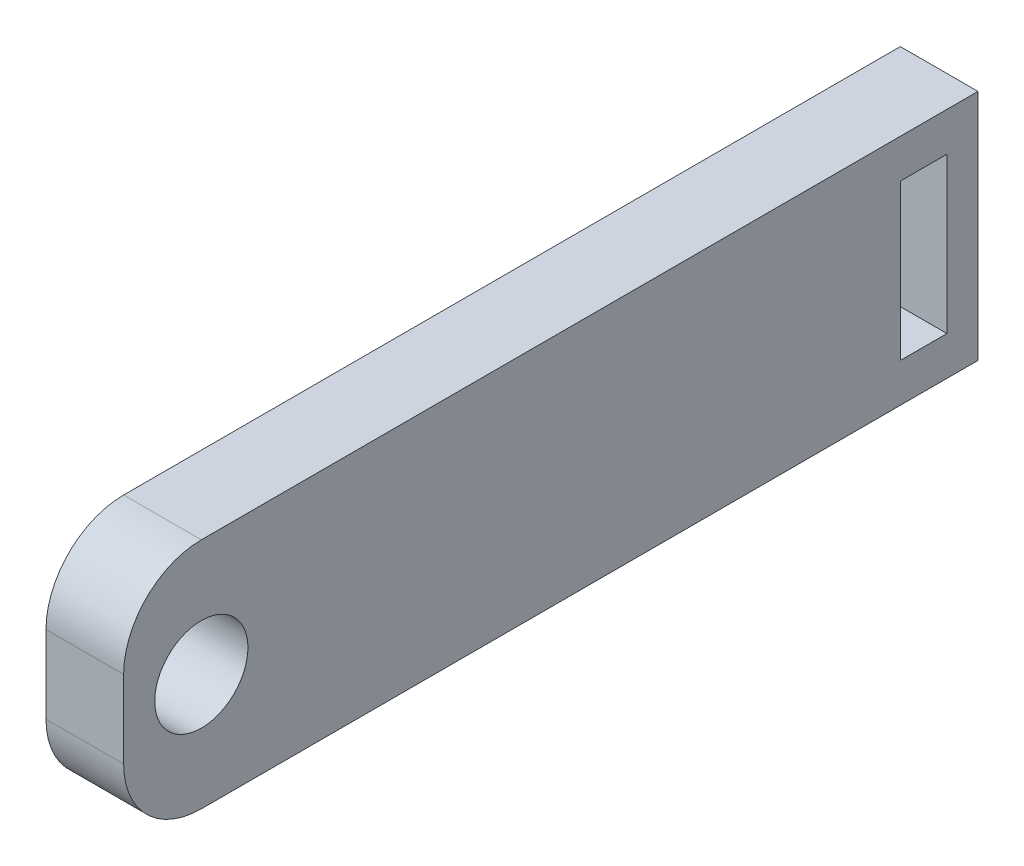
ISO-10303-21;
HEADER;
FILE_DESCRIPTION(('STEP AP214'),'2;1');
FILE_NAME('part.step','',(''),(''),'','','');
FILE_SCHEMA(('AUTOMOTIVE_DESIGN { 1 0 10303 214 1 1 1 1 }'));
ENDSEC;
DATA;
#1=APPLICATION_CONTEXT('core data for automotive mechanical design processes');
#2=APPLICATION_PROTOCOL_DEFINITION('international standard','automotive_design',2000,#1);
#3=PRODUCT_CONTEXT('',#1,'mechanical');
#4=PRODUCT('Part','Part','',(#3));
#5=PRODUCT_RELATED_PRODUCT_CATEGORY('part','',(#4));
#6=PRODUCT_DEFINITION_FORMATION('','',#4);
#7=PRODUCT_DEFINITION_CONTEXT('part definition',#1,'design');
#8=PRODUCT_DEFINITION('design','',#6,#7);
#9=PRODUCT_DEFINITION_SHAPE('','',#8);
#10=(LENGTH_UNIT() NAMED_UNIT(*) SI_UNIT(.MILLI.,.METRE.));
#11=(NAMED_UNIT(*) PLANE_ANGLE_UNIT() SI_UNIT($,.RADIAN.));
#12=(NAMED_UNIT(*) SI_UNIT($,.STERADIAN.) SOLID_ANGLE_UNIT());
#13=UNCERTAINTY_MEASURE_WITH_UNIT(LENGTH_MEASURE(1.E-05),#10,'distance_accuracy_value','');
#14=(GEOMETRIC_REPRESENTATION_CONTEXT(3) GLOBAL_UNCERTAINTY_ASSIGNED_CONTEXT((#13)) GLOBAL_UNIT_ASSIGNED_CONTEXT((#10,
#11,#12)) REPRESENTATION_CONTEXT('',''));
#15=CARTESIAN_POINT('',(0.,0.,0.));
#16=DIRECTION('',(0.,0.,1.));
#17=DIRECTION('',(1.,0.,0.));
#18=AXIS2_PLACEMENT_3D('',#15,#16,#17);
#19=CARTESIAN_POINT('',(0.,15.,26.2097315436242));
#20=DIRECTION('',(0.,0.,-1.));
#21=DIRECTION('',(-1.,0.,0.));
#22=AXIS2_PLACEMENT_3D('',#19,#20,#21);
#23=PLANE('',#22);
#24=DIRECTION('',(0.,-1.,0.));
#25=VECTOR('',#24,1.);
#26=CARTESIAN_POINT('',(-56.8805369127517,15.,26.2097315436242));
#27=LINE('',#26,#25);
#28=CARTESIAN_POINT('',(-56.8805369127517,10.,26.2097315436242));
#29=VERTEX_POINT('',#28);
#30=CARTESIAN_POINT('',(-56.8805369127517,5.,26.2097315436242));
#31=VERTEX_POINT('',#30);
#32=EDGE_CURVE('E197',#29,#31,#27,.T.);
#33=ORIENTED_EDGE('',*,*,#32,.F.);
#34=DIRECTION('',(1.,0.,0.));
#35=VECTOR('',#34,1.);
#36=CARTESIAN_POINT('',(-61.8805369127517,10.,26.2097315436242));
#37=LINE('',#36,#35);
#38=CARTESIAN_POINT('',(-61.8805369127517,10.,26.2097315436242));
#39=VERTEX_POINT('',#38);
#40=EDGE_CURVE('E215',#29,#39,#37,.F.);
#41=ORIENTED_EDGE('',*,*,#40,.T.);
#42=DIRECTION('',(0.,-1.,0.));
#43=VECTOR('',#42,1.);
#44=CARTESIAN_POINT('',(-61.8805369127517,15.,26.2097315436242));
#45=LINE('',#44,#43);
#46=CARTESIAN_POINT('',(-61.8805369127517,5.,26.2097315436242));
#47=VERTEX_POINT('',#46);
#48=EDGE_CURVE('E176',#39,#47,#45,.T.);
#49=ORIENTED_EDGE('',*,*,#48,.T.);
#50=DIRECTION('',(1.,0.,0.));
#51=VECTOR('',#50,1.);
#52=CARTESIAN_POINT('',(0.,5.,26.2097315436242));
#53=LINE('',#52,#51);
#54=EDGE_CURVE('E211',#47,#31,#53,.T.);
#55=ORIENTED_EDGE('',*,*,#54,.T.);
#56=EDGE_LOOP('',(#33,#41,#49,#55));
#57=FACE_BOUND('',#56,.T.);
#58=ADVANCED_FACE('F41',(#57),#23,.F.);
#59=CARTESIAN_POINT('',(-56.8805369127517,15.,0.));
#60=DIRECTION('',(-1.,0.,0.));
#61=DIRECTION('',(0.,0.,1.));
#62=AXIS2_PLACEMENT_3D('',#59,#60,#61);
#63=PLANE('',#62);
#64=CARTESIAN_POINT('',(-56.8805369127516,7.5,21.2097315436242));
#65=DIRECTION('',(-1.,0.,0.));
#66=DIRECTION('',(0.,0.,1.));
#67=AXIS2_PLACEMENT_3D('',#64,#65,#66);
#68=CIRCLE('',#67,3.);
#69=CARTESIAN_POINT('',(-56.8805369127516,7.5,24.2097315436242));
#70=VERTEX_POINT('',#69);
#71=EDGE_CURVE('E181',#70,#70,#68,.F.);
#72=ORIENTED_EDGE('',*,*,#71,.F.);
#73=EDGE_LOOP('',(#72));
#74=FACE_BOUND('',#73,.T.);
#75=DIRECTION('',(0.,0.,1.));
#76=VECTOR('',#75,1.);
#77=CARTESIAN_POINT('',(-56.8805369127517,12.5,-26.7902684563758));
#78=LINE('',#77,#76);
#79=CARTESIAN_POINT('',(-56.8805369127517,12.5,-26.7902684563758));
#80=VERTEX_POINT('',#79);
#81=CARTESIAN_POINT('',(-56.8805369127517,12.5,-23.7902684563758));
#82=VERTEX_POINT('',#81);
#83=EDGE_CURVE('E362',#80,#82,#78,.T.);
#84=ORIENTED_EDGE('',*,*,#83,.F.);
#85=DIRECTION('',(0.,1.,0.));
#86=VECTOR('',#85,1.);
#87=CARTESIAN_POINT('',(-56.8805369127517,2.5,-26.7902684563758));
#88=LINE('',#87,#86);
#89=CARTESIAN_POINT('',(-56.8805369127517,2.5,-26.7902684563758));
#90=VERTEX_POINT('',#89);
#91=EDGE_CURVE('E164',#90,#80,#88,.T.);
#92=ORIENTED_EDGE('',*,*,#91,.F.);
#93=DIRECTION('',(0.,0.,-1.));
#94=VECTOR('',#93,1.);
#95=CARTESIAN_POINT('',(-56.8805369127517,2.5,-26.7902684563758));
#96=LINE('',#95,#94);
#97=CARTESIAN_POINT('',(-56.8805369127517,2.5,-23.7902684563758));
#98=VERTEX_POINT('',#97);
#99=EDGE_CURVE('E160',#98,#90,#96,.T.);
#100=ORIENTED_EDGE('',*,*,#99,.F.);
#101=DIRECTION('',(0.,-1.,0.));
#102=VECTOR('',#101,1.);
#103=CARTESIAN_POINT('',(-56.8805369127517,2.5,-23.7902684563758));
#104=LINE('',#103,#102);
#105=EDGE_CURVE('E127',#82,#98,#104,.T.);
#106=ORIENTED_EDGE('',*,*,#105,.F.);
#107=EDGE_LOOP('',(#84,#92,#100,#106));
#108=FACE_BOUND('',#107,.T.);
#109=DIRECTION('',(0.,0.,-1.));
#110=VECTOR('',#109,1.);
#111=CARTESIAN_POINT('',(-56.8805369127517,15.,0.));
#112=LINE('',#111,#110);
#113=CARTESIAN_POINT('',(-56.8805369127517,15.,21.2097315436242));
#114=VERTEX_POINT('',#113);
#115=CARTESIAN_POINT('',(-56.8805369127517,15.,-28.7902684563758));
#116=VERTEX_POINT('',#115);
#117=EDGE_CURVE('E165',#114,#116,#112,.T.);
#118=ORIENTED_EDGE('',*,*,#117,.F.);
#119=CARTESIAN_POINT('',(-56.8805369127517,10.,21.2097315436242));
#120=DIRECTION('',(-1.,0.,0.));
#121=DIRECTION('',(0.,0.,1.));
#122=AXIS2_PLACEMENT_3D('',#119,#120,#121);
#123=CIRCLE('',#122,5.);
#124=EDGE_CURVE('E208',#114,#29,#123,.F.);
#125=ORIENTED_EDGE('',*,*,#124,.T.);
#126=ORIENTED_EDGE('',*,*,#32,.T.);
#127=CARTESIAN_POINT('',(-56.8805369127517,5.,21.2097315436242));
#128=DIRECTION('',(-1.,0.,0.));
#129=DIRECTION('',(0.,0.,1.));
#130=AXIS2_PLACEMENT_3D('',#127,#128,#129);
#131=CIRCLE('',#130,5.);
#132=CARTESIAN_POINT('',(-56.8805369127517,0.,21.2097315436242));
#133=VERTEX_POINT('',#132);
#134=EDGE_CURVE('E205',#31,#133,#131,.F.);
#135=ORIENTED_EDGE('',*,*,#134,.T.);
#136=DIRECTION('',(0.,0.,-1.));
#137=VECTOR('',#136,1.);
#138=CARTESIAN_POINT('',(-56.8805369127517,0.,0.));
#139=LINE('',#138,#137);
#140=CARTESIAN_POINT('',(-56.8805369127517,0.,-28.7902684563758));
#141=VERTEX_POINT('',#140);
#142=EDGE_CURVE('E177',#133,#141,#139,.T.);
#143=ORIENTED_EDGE('',*,*,#142,.T.);
#144=DIRECTION('',(0.,-1.,0.));
#145=VECTOR('',#144,1.);
#146=CARTESIAN_POINT('',(-56.8805369127517,15.,-28.7902684563758));
#147=LINE('',#146,#145);
#148=EDGE_CURVE('E193',#116,#141,#147,.T.);
#149=ORIENTED_EDGE('',*,*,#148,.F.);
#150=EDGE_LOOP('',(#118,#125,#126,#135,#143,#149));
#151=FACE_BOUND('',#150,.T.);
#152=ADVANCED_FACE('F233',(#74,#108,#151),#63,.F.);
#153=CARTESIAN_POINT('',(0.,15.,-28.7902684563758));
#154=DIRECTION('',(0.,0.,-1.));
#155=DIRECTION('',(-1.,0.,0.));
#156=AXIS2_PLACEMENT_3D('',#153,#154,#155);
#157=PLANE('',#156);
#158=DIRECTION('',(1.,0.,0.));
#159=VECTOR('',#158,1.);
#160=CARTESIAN_POINT('',(0.,0.,-28.7902684563758));
#161=LINE('',#160,#159);
#162=CARTESIAN_POINT('',(-61.8805369127517,0.,-28.7902684563758));
#163=VERTEX_POINT('',#162);
#164=EDGE_CURVE('E180',#163,#141,#161,.T.);
#165=ORIENTED_EDGE('',*,*,#164,.F.);
#166=DIRECTION('',(0.,-1.,0.));
#167=VECTOR('',#166,1.);
#168=CARTESIAN_POINT('',(-61.8805369127517,15.,-28.7902684563758));
#169=LINE('',#168,#167);
#170=CARTESIAN_POINT('',(-61.8805369127517,15.,-28.7902684563758));
#171=VERTEX_POINT('',#170);
#172=EDGE_CURVE('E189',#171,#163,#169,.T.);
#173=ORIENTED_EDGE('',*,*,#172,.F.);
#174=DIRECTION('',(1.,0.,0.));
#175=VECTOR('',#174,1.);
#176=CARTESIAN_POINT('',(0.,15.,-28.7902684563758));
#177=LINE('',#176,#175);
#178=EDGE_CURVE('E168',#171,#116,#177,.T.);
#179=ORIENTED_EDGE('',*,*,#178,.T.);
#180=ORIENTED_EDGE('',*,*,#148,.T.);
#181=EDGE_LOOP('',(#165,#173,#179,#180));
#182=FACE_BOUND('',#181,.T.);
#183=ADVANCED_FACE('F241',(#182),#157,.T.);
#184=CARTESIAN_POINT('',(-61.8805369127517,15.,0.));
#185=DIRECTION('',(-1.,0.,0.));
#186=DIRECTION('',(0.,0.,1.));
#187=AXIS2_PLACEMENT_3D('',#184,#185,#186);
#188=PLANE('',#187);
#189=CARTESIAN_POINT('',(-61.8805369127517,7.5,21.2097315436242));
#190=DIRECTION('',(-1.,0.,0.));
#191=DIRECTION('',(0.,0.,1.));
#192=AXIS2_PLACEMENT_3D('',#189,#190,#191);
#193=CIRCLE('',#192,3.);
#194=CARTESIAN_POINT('',(-61.8805369127517,7.5,24.2097315436242));
#195=VERTEX_POINT('',#194);
#196=EDGE_CURVE('E163',#195,#195,#193,.T.);
#197=ORIENTED_EDGE('',*,*,#196,.F.);
#198=EDGE_LOOP('',(#197));
#199=FACE_BOUND('',#198,.T.);
#200=DIRECTION('',(0.,-1.,0.));
#201=VECTOR('',#200,1.);
#202=CARTESIAN_POINT('',(-61.8805369127517,2.5,-26.7902684563758));
#203=LINE('',#202,#201);
#204=CARTESIAN_POINT('',(-61.8805369127517,12.5,-26.7902684563758));
#205=VERTEX_POINT('',#204);
#206=CARTESIAN_POINT('',(-61.8805369127517,2.5,-26.7902684563758));
#207=VERTEX_POINT('',#206);
#208=EDGE_CURVE('E142',#205,#207,#203,.T.);
#209=ORIENTED_EDGE('',*,*,#208,.F.);
#210=DIRECTION('',(0.,0.,-1.));
#211=VECTOR('',#210,1.);
#212=CARTESIAN_POINT('',(-61.8805369127517,12.5,-26.7902684563758));
#213=LINE('',#212,#211);
#214=CARTESIAN_POINT('',(-61.8805369127517,12.5,-23.7902684563758));
#215=VERTEX_POINT('',#214);
#216=EDGE_CURVE('E146',#215,#205,#213,.T.);
#217=ORIENTED_EDGE('',*,*,#216,.F.);
#218=DIRECTION('',(0.,1.,0.));
#219=VECTOR('',#218,1.);
#220=CARTESIAN_POINT('',(-61.8805369127517,2.5,-23.7902684563758));
#221=LINE('',#220,#219);
#222=CARTESIAN_POINT('',(-61.8805369127517,2.5,-23.7902684563758));
#223=VERTEX_POINT('',#222);
#224=EDGE_CURVE('E124',#223,#215,#221,.T.);
#225=ORIENTED_EDGE('',*,*,#224,.F.);
#226=DIRECTION('',(0.,0.,1.));
#227=VECTOR('',#226,1.);
#228=CARTESIAN_POINT('',(-61.8805369127517,2.5,-26.7902684563758));
#229=LINE('',#228,#227);
#230=EDGE_CURVE('E136',#207,#223,#229,.T.);
#231=ORIENTED_EDGE('',*,*,#230,.F.);
#232=EDGE_LOOP('',(#209,#217,#225,#231));
#233=FACE_BOUND('',#232,.T.);
#234=ORIENTED_EDGE('',*,*,#48,.F.);
#235=CARTESIAN_POINT('',(-61.8805369127517,10.,21.2097315436242));
#236=DIRECTION('',(-1.,0.,0.));
#237=DIRECTION('',(0.,0.,1.));
#238=AXIS2_PLACEMENT_3D('',#235,#236,#237);
#239=CIRCLE('',#238,5.);
#240=CARTESIAN_POINT('',(-61.8805369127517,15.,21.2097315436242));
#241=VERTEX_POINT('',#240);
#242=EDGE_CURVE('E50',#39,#241,#239,.T.);
#243=ORIENTED_EDGE('',*,*,#242,.T.);
#244=DIRECTION('',(0.,0.,-1.));
#245=VECTOR('',#244,1.);
#246=CARTESIAN_POINT('',(-61.8805369127517,15.,0.));
#247=LINE('',#246,#245);
#248=EDGE_CURVE('E173',#241,#171,#247,.T.);
#249=ORIENTED_EDGE('',*,*,#248,.T.);
#250=ORIENTED_EDGE('',*,*,#172,.T.);
#251=DIRECTION('',(0.,0.,-1.));
#252=VECTOR('',#251,1.);
#253=CARTESIAN_POINT('',(-61.8805369127517,0.,0.));
#254=LINE('',#253,#252);
#255=CARTESIAN_POINT('',(-61.8805369127517,0.,21.2097315436242));
#256=VERTEX_POINT('',#255);
#257=EDGE_CURVE('E169',#256,#163,#254,.T.);
#258=ORIENTED_EDGE('',*,*,#257,.F.);
#259=CARTESIAN_POINT('',(-61.8805369127517,5.,21.2097315436242));
#260=DIRECTION('',(-1.,0.,0.));
#261=DIRECTION('',(0.,0.,1.));
#262=AXIS2_PLACEMENT_3D('',#259,#260,#261);
#263=CIRCLE('',#262,5.);
#264=EDGE_CURVE('E62',#256,#47,#263,.T.);
#265=ORIENTED_EDGE('',*,*,#264,.T.);
#266=EDGE_LOOP('',(#234,#243,#249,#250,#258,#265));
#267=FACE_BOUND('',#266,.T.);
#268=ADVANCED_FACE('F144',(#199,#233,#267),#188,.T.);
#269=CARTESIAN_POINT('',(0.,15.,0.));
#270=DIRECTION('',(0.,1.,0.));
#271=DIRECTION('',(0.,0.,1.));
#272=AXIS2_PLACEMENT_3D('',#269,#270,#271);
#273=PLANE('',#272);
#274=ORIENTED_EDGE('',*,*,#248,.F.);
#275=DIRECTION('',(1.,0.,0.));
#276=VECTOR('',#275,1.);
#277=CARTESIAN_POINT('',(-56.8805369127517,15.,21.2097315436242));
#278=LINE('',#277,#276);
#279=EDGE_CURVE('E201',#241,#114,#278,.T.);
#280=ORIENTED_EDGE('',*,*,#279,.T.);
#281=ORIENTED_EDGE('',*,*,#117,.T.);
#282=ORIENTED_EDGE('',*,*,#178,.F.);
#283=EDGE_LOOP('',(#274,#280,#281,#282));
#284=FACE_BOUND('',#283,.T.);
#285=ADVANCED_FACE('F228',(#284),#273,.T.);
#286=CARTESIAN_POINT('',(0.,0.,0.));
#287=DIRECTION('',(0.,1.,0.));
#288=DIRECTION('',(0.,0.,1.));
#289=AXIS2_PLACEMENT_3D('',#286,#287,#288);
#290=PLANE('',#289);
#291=ORIENTED_EDGE('',*,*,#142,.F.);
#292=DIRECTION('',(1.,0.,0.));
#293=VECTOR('',#292,1.);
#294=CARTESIAN_POINT('',(0.,0.,21.2097315436242));
#295=LINE('',#294,#293);
#296=EDGE_CURVE('E11',#133,#256,#295,.F.);
#297=ORIENTED_EDGE('',*,*,#296,.T.);
#298=ORIENTED_EDGE('',*,*,#257,.T.);
#299=ORIENTED_EDGE('',*,*,#164,.T.);
#300=EDGE_LOOP('',(#291,#297,#298,#299));
#301=FACE_BOUND('',#300,.T.);
#302=ADVANCED_FACE('F238',(#301),#290,.F.);
#303=CARTESIAN_POINT('',(-46.4402304038411,2.5,-26.7902684563758));
#304=DIRECTION('',(0.,0.,-1.));
#305=DIRECTION('',(-1.,0.,0.));
#306=AXIS2_PLACEMENT_3D('',#303,#304,#305);
#307=PLANE('',#306);
#308=ORIENTED_EDGE('',*,*,#91,.T.);
#309=DIRECTION('',(-1.,0.,0.));
#310=VECTOR('',#309,1.);
#311=CARTESIAN_POINT('',(-46.4402304038411,12.5,-26.7902684563758));
#312=LINE('',#311,#310);
#313=EDGE_CURVE('E153',#80,#205,#312,.T.);
#314=ORIENTED_EDGE('',*,*,#313,.T.);
#315=ORIENTED_EDGE('',*,*,#208,.T.);
#316=DIRECTION('',(-1.,0.,0.));
#317=VECTOR('',#316,1.);
#318=CARTESIAN_POINT('',(-46.4402304038411,2.5,-26.7902684563758));
#319=LINE('',#318,#317);
#320=EDGE_CURVE('E132',#90,#207,#319,.T.);
#321=ORIENTED_EDGE('',*,*,#320,.F.);
#322=EDGE_LOOP('',(#308,#314,#315,#321));
#323=FACE_BOUND('',#322,.T.);
#324=ADVANCED_FACE('F274',(#323),#307,.F.);
#325=CARTESIAN_POINT('',(-46.4402304038411,12.5,-26.7902684563758));
#326=DIRECTION('',(0.,1.,0.));
#327=DIRECTION('',(0.,0.,1.));
#328=AXIS2_PLACEMENT_3D('',#325,#326,#327);
#329=PLANE('',#328);
#330=ORIENTED_EDGE('',*,*,#83,.T.);
#331=DIRECTION('',(-1.,0.,0.));
#332=VECTOR('',#331,1.);
#333=CARTESIAN_POINT('',(-46.4402304038411,12.5,-23.7902684563758));
#334=LINE('',#333,#332);
#335=EDGE_CURVE('E131',#82,#215,#334,.T.);
#336=ORIENTED_EDGE('',*,*,#335,.T.);
#337=ORIENTED_EDGE('',*,*,#216,.T.);
#338=ORIENTED_EDGE('',*,*,#313,.F.);
#339=EDGE_LOOP('',(#330,#336,#337,#338));
#340=FACE_BOUND('',#339,.T.);
#341=ADVANCED_FACE('F271',(#340),#329,.F.);
#342=CARTESIAN_POINT('',(-46.4402304038411,2.5,-23.7902684563758));
#343=DIRECTION('',(0.,0.,1.));
#344=DIRECTION('',(1.,0.,0.));
#345=AXIS2_PLACEMENT_3D('',#342,#343,#344);
#346=PLANE('',#345);
#347=ORIENTED_EDGE('',*,*,#105,.T.);
#348=DIRECTION('',(-1.,0.,0.));
#349=VECTOR('',#348,1.);
#350=CARTESIAN_POINT('',(-46.4402304038411,2.5,-23.7902684563758));
#351=LINE('',#350,#349);
#352=EDGE_CURVE('E119',#98,#223,#351,.T.);
#353=ORIENTED_EDGE('',*,*,#352,.T.);
#354=ORIENTED_EDGE('',*,*,#224,.T.);
#355=ORIENTED_EDGE('',*,*,#335,.F.);
#356=EDGE_LOOP('',(#347,#353,#354,#355));
#357=FACE_BOUND('',#356,.T.);
#358=ADVANCED_FACE('F121',(#357),#346,.F.);
#359=CARTESIAN_POINT('',(-46.4402304038411,2.5,-26.7902684563758));
#360=DIRECTION('',(0.,-1.,0.));
#361=DIRECTION('',(0.,0.,-1.));
#362=AXIS2_PLACEMENT_3D('',#359,#360,#361);
#363=PLANE('',#362);
#364=ORIENTED_EDGE('',*,*,#99,.T.);
#365=ORIENTED_EDGE('',*,*,#320,.T.);
#366=ORIENTED_EDGE('',*,*,#230,.T.);
#367=ORIENTED_EDGE('',*,*,#352,.F.);
#368=EDGE_LOOP('',(#364,#365,#366,#367));
#369=FACE_BOUND('',#368,.T.);
#370=ADVANCED_FACE('F137',(#369),#363,.F.);
#371=CARTESIAN_POINT('',(-46.4402304038411,7.5,21.2097315436242));
#372=DIRECTION('',(-1.,0.,0.));
#373=DIRECTION('',(0.,0.,1.));
#374=AXIS2_PLACEMENT_3D('',#371,#372,#373);
#375=CYLINDRICAL_SURFACE('',#374,3.);
#376=CARTESIAN_POINT('',(-56.8805369127516,7.5,24.2097315436242));
#377=CARTESIAN_POINT('',(-56.932620246085,7.5,24.2097315436242));
#378=CARTESIAN_POINT('',(-56.9847035794183,7.5,24.2097315436242));
#379=CARTESIAN_POINT('',(-57.088870246085,7.5,24.2097315436242));
#380=CARTESIAN_POINT('',(-57.1409535794183,7.5,24.2097315436242));
#381=CARTESIAN_POINT('',(-57.245120246085,7.5,24.2097315436242));
#382=CARTESIAN_POINT('',(-57.2972035794183,7.5,24.2097315436242));
#383=CARTESIAN_POINT('',(-57.401370246085,7.5,24.2097315436242));
#384=CARTESIAN_POINT('',(-57.4534535794183,7.5,24.2097315436242));
#385=CARTESIAN_POINT('',(-57.557620246085,7.5,24.2097315436242));
#386=CARTESIAN_POINT('',(-57.6097035794183,7.5,24.2097315436242));
#387=CARTESIAN_POINT('',(-57.713870246085,7.5,24.2097315436242));
#388=CARTESIAN_POINT('',(-57.7659535794183,7.5,24.2097315436242));
#389=CARTESIAN_POINT('',(-57.870120246085,7.5,24.2097315436242));
#390=CARTESIAN_POINT('',(-57.9222035794183,7.5,24.2097315436242));
#391=CARTESIAN_POINT('',(-58.026370246085,7.5,24.2097315436242));
#392=CARTESIAN_POINT('',(-58.0784535794183,7.5,24.2097315436242));
#393=CARTESIAN_POINT('',(-58.182620246085,7.5,24.2097315436242));
#394=CARTESIAN_POINT('',(-58.2347035794183,7.5,24.2097315436242));
#395=CARTESIAN_POINT('',(-58.338870246085,7.5,24.2097315436242));
#396=CARTESIAN_POINT('',(-58.3909535794183,7.5,24.2097315436242));
#397=CARTESIAN_POINT('',(-58.495120246085,7.5,24.2097315436242));
#398=CARTESIAN_POINT('',(-58.5472035794183,7.5,24.2097315436242));
#399=CARTESIAN_POINT('',(-58.651370246085,7.5,24.2097315436242));
#400=CARTESIAN_POINT('',(-58.7034535794183,7.5,24.2097315436242));
#401=CARTESIAN_POINT('',(-58.807620246085,7.5,24.2097315436242));
#402=CARTESIAN_POINT('',(-58.8597035794183,7.5,24.2097315436242));
#403=CARTESIAN_POINT('',(-58.963870246085,7.5,24.2097315436242));
#404=CARTESIAN_POINT('',(-59.0159535794183,7.5,24.2097315436242));
#405=CARTESIAN_POINT('',(-59.120120246085,7.5,24.2097315436242));
#406=CARTESIAN_POINT('',(-59.1722035794183,7.5,24.2097315436242));
#407=CARTESIAN_POINT('',(-59.276370246085,7.5,24.2097315436242));
#408=CARTESIAN_POINT('',(-59.3284535794183,7.5,24.2097315436242));
#409=CARTESIAN_POINT('',(-59.432620246085,7.5,24.2097315436242));
#410=CARTESIAN_POINT('',(-59.4847035794183,7.5,24.2097315436242));
#411=CARTESIAN_POINT('',(-59.588870246085,7.5,24.2097315436242));
#412=CARTESIAN_POINT('',(-59.6409535794183,7.5,24.2097315436242));
#413=CARTESIAN_POINT('',(-59.745120246085,7.5,24.2097315436242));
#414=CARTESIAN_POINT('',(-59.7972035794183,7.5,24.2097315436242));
#415=CARTESIAN_POINT('',(-59.901370246085,7.5,24.2097315436242));
#416=CARTESIAN_POINT('',(-59.9534535794183,7.5,24.2097315436242));
#417=CARTESIAN_POINT('',(-60.057620246085,7.5,24.2097315436242));
#418=CARTESIAN_POINT('',(-60.1097035794183,7.5,24.2097315436242));
#419=CARTESIAN_POINT('',(-60.213870246085,7.5,24.2097315436242));
#420=CARTESIAN_POINT('',(-60.2659535794183,7.5,24.2097315436242));
#421=CARTESIAN_POINT('',(-60.370120246085,7.5,24.2097315436242));
#422=CARTESIAN_POINT('',(-60.4222035794183,7.5,24.2097315436242));
#423=CARTESIAN_POINT('',(-60.526370246085,7.5,24.2097315436242));
#424=CARTESIAN_POINT('',(-60.5784535794183,7.5,24.2097315436242));
#425=CARTESIAN_POINT('',(-60.682620246085,7.5,24.2097315436242));
#426=CARTESIAN_POINT('',(-60.7347035794183,7.5,24.2097315436242));
#427=CARTESIAN_POINT('',(-60.838870246085,7.5,24.2097315436242));
#428=CARTESIAN_POINT('',(-60.8909535794183,7.5,24.2097315436242));
#429=CARTESIAN_POINT('',(-60.995120246085,7.5,24.2097315436242));
#430=CARTESIAN_POINT('',(-61.0472035794183,7.5,24.2097315436242));
#431=CARTESIAN_POINT('',(-61.151370246085,7.5,24.2097315436242));
#432=CARTESIAN_POINT('',(-61.2034535794183,7.5,24.2097315436242));
#433=CARTESIAN_POINT('',(-61.307620246085,7.5,24.2097315436242));
#434=CARTESIAN_POINT('',(-61.3597035794183,7.5,24.2097315436242));
#435=CARTESIAN_POINT('',(-61.463870246085,7.5,24.2097315436242));
#436=CARTESIAN_POINT('',(-61.5159535794183,7.5,24.2097315436242));
#437=CARTESIAN_POINT('',(-61.620120246085,7.5,24.2097315436242));
#438=CARTESIAN_POINT('',(-61.6722035794183,7.5,24.2097315436242));
#439=CARTESIAN_POINT('',(-61.776370246085,7.5,24.2097315436242));
#440=CARTESIAN_POINT('',(-61.8284535794183,7.5,24.2097315436242));
#441=CARTESIAN_POINT('',(-61.8805369127517,7.5,24.2097315436242));
#442=B_SPLINE_CURVE_WITH_KNOTS('',3,(#376,#377,#378,#379,#380,#381,#382,#383,#384,#385,#386,
#387,#388,#389,#390,#391,#392,#393,#394,#395,#396,#397,#398,#399,#400,#401,#402,#403,#404,#405,
#406,#407,#408,#409,#410,#411,#412,#413,#414,#415,#416,#417,#418,#419,#420,#421,#422,#423,#424,
#425,#426,#427,#428,#429,#430,#431,#432,#433,#434,#435,#436,#437,#438,#439,#440,#441),
.UNSPECIFIED.,.F.,.F.,(4,2,2,2,2,2,2,2,2,2,2,2,2,2,2,2,2,2,2,2,2,2,2,2,2,2,2,2,2,2,2,2,4),(0.,
0.156250000000004,0.3125,0.468750000000004,0.625000000000008,0.781250000000004,
0.937500000000001,1.09375,1.25000000000001,1.40625,1.56250000000001,1.71875,1.87500000000001,
2.03125000000001,2.18750000000001,2.34375000000001,2.50000000000001,2.65625000000001,
2.81250000000001,2.96875000000001,3.12500000000001,3.28125000000001,3.43750000000001,
3.59375000000001,3.75000000000001,3.90625000000001,4.06250000000002,4.21875000000001,
4.37500000000001,4.53125000000001,4.68750000000002,4.84375000000002,5.00000000000002),.UNSPECIFIED.);
#443=EDGE_CURVE('BSEAM257',#70,#195,#442,.T.);
#444=ORIENTED_EDGE('',*,*,#71,.T.);
#445=ORIENTED_EDGE('',*,*,#196,.T.);
#446=ORIENTED_EDGE('',*,*,#443,.T.);
#447=ORIENTED_EDGE('',*,*,#443,.F.);
#448=EDGE_LOOP('',(#444,#446,#445,#447));
#449=FACE_BOUND('',#448,.T.);
#450=ADVANCED_FACE('F257',(#449),#375,.F.);
#451=CARTESIAN_POINT('',(0.,10.,21.2097315436242));
#452=DIRECTION('',(-1.,0.,0.));
#453=DIRECTION('',(0.,0.,1.));
#454=AXIS2_PLACEMENT_3D('',#451,#452,#453);
#455=CYLINDRICAL_SURFACE('',#454,5.);
#456=ORIENTED_EDGE('',*,*,#242,.F.);
#457=ORIENTED_EDGE('',*,*,#40,.F.);
#458=ORIENTED_EDGE('',*,*,#124,.F.);
#459=ORIENTED_EDGE('',*,*,#279,.F.);
#460=EDGE_LOOP('',(#456,#457,#458,#459));
#461=FACE_BOUND('',#460,.T.);
#462=ADVANCED_FACE('F230',(#461),#455,.T.);
#463=CARTESIAN_POINT('',(0.,5.,21.2097315436242));
#464=DIRECTION('',(1.,0.,0.));
#465=DIRECTION('',(0.,0.,-1.));
#466=AXIS2_PLACEMENT_3D('',#463,#464,#465);
#467=CYLINDRICAL_SURFACE('',#466,5.);
#468=ORIENTED_EDGE('',*,*,#264,.F.);
#469=ORIENTED_EDGE('',*,*,#296,.F.);
#470=ORIENTED_EDGE('',*,*,#134,.F.);
#471=ORIENTED_EDGE('',*,*,#54,.F.);
#472=EDGE_LOOP('',(#468,#469,#470,#471));
#473=FACE_BOUND('',#472,.T.);
#474=ADVANCED_FACE('F43',(#473),#467,.T.);
#475=CLOSED_SHELL('',(#58,#152,#183,#268,#285,#302,#324,#341,#358,#370,#450,#462,#474));
#476=MANIFOLD_SOLID_BREP('B2',#475);
#477=ADVANCED_BREP_SHAPE_REPRESENTATION('',(#18,#476),#14);
#478=SHAPE_DEFINITION_REPRESENTATION(#9,#477);
ENDSEC;
END-ISO-10303-21;
